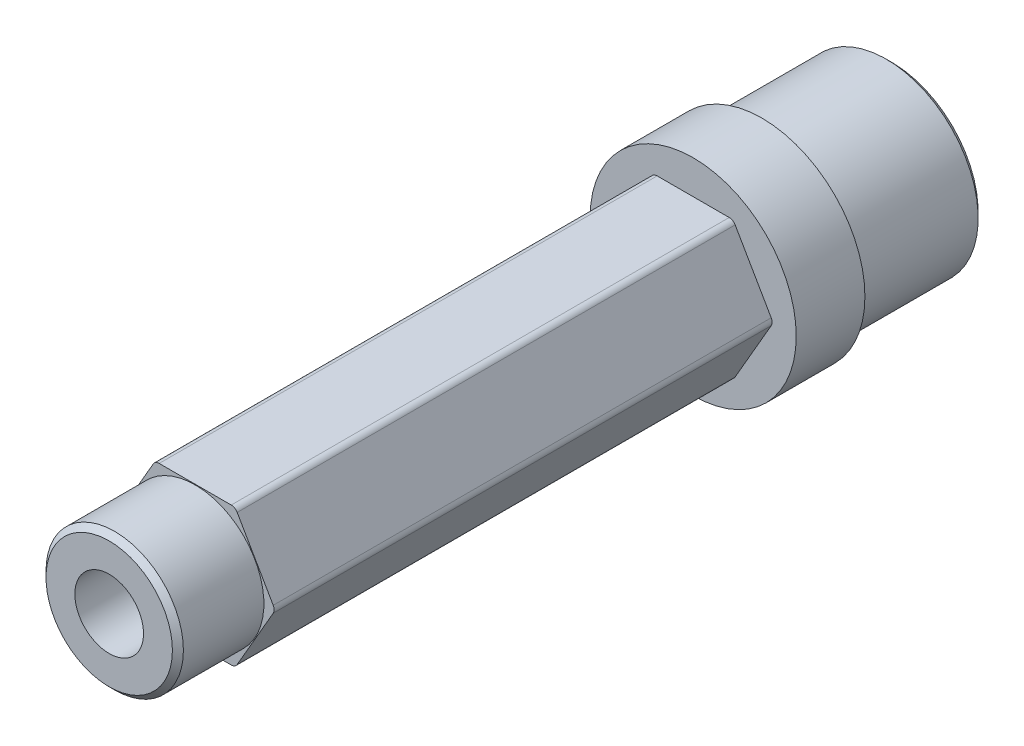
ISO-10303-21;
HEADER;
FILE_DESCRIPTION(('STEP AP214'),'2;1');
FILE_NAME('part.step','',(''),(''),'','','');
FILE_SCHEMA(('AUTOMOTIVE_DESIGN { 1 0 10303 214 1 1 1 1 }'));
ENDSEC;
DATA;
#1=APPLICATION_CONTEXT('core data for automotive mechanical design processes');
#2=APPLICATION_PROTOCOL_DEFINITION('international standard','automotive_design',2000,#1);
#3=PRODUCT_CONTEXT('',#1,'mechanical');
#4=PRODUCT('Part','Part','',(#3));
#5=PRODUCT_RELATED_PRODUCT_CATEGORY('part','',(#4));
#6=PRODUCT_DEFINITION_FORMATION('','',#4);
#7=PRODUCT_DEFINITION_CONTEXT('part definition',#1,'design');
#8=PRODUCT_DEFINITION('design','',#6,#7);
#9=PRODUCT_DEFINITION_SHAPE('','',#8);
#10=(LENGTH_UNIT() NAMED_UNIT(*) SI_UNIT(.MILLI.,.METRE.));
#11=(NAMED_UNIT(*) PLANE_ANGLE_UNIT() SI_UNIT($,.RADIAN.));
#12=(NAMED_UNIT(*) SI_UNIT($,.STERADIAN.) SOLID_ANGLE_UNIT());
#13=UNCERTAINTY_MEASURE_WITH_UNIT(LENGTH_MEASURE(1.E-05),#10,'distance_accuracy_value','');
#14=(GEOMETRIC_REPRESENTATION_CONTEXT(3) GLOBAL_UNCERTAINTY_ASSIGNED_CONTEXT((#13)) GLOBAL_UNIT_ASSIGNED_CONTEXT((#10,
#11,#12)) REPRESENTATION_CONTEXT('',''));
#15=CARTESIAN_POINT('',(0.,0.,0.));
#16=DIRECTION('',(0.,0.,1.));
#17=DIRECTION('',(1.,0.,0.));
#18=AXIS2_PLACEMENT_3D('',#15,#16,#17);
#19=CARTESIAN_POINT('',(0.,8.50000000000001,-72.33270001));
#20=DIRECTION('',(0.,0.,-1.));
#21=DIRECTION('',(-1.,0.,0.));
#22=AXIS2_PLACEMENT_3D('',#19,#20,#21);
#23=PLANE('',#22);
#24=CARTESIAN_POINT('',(0.,0.,-72.33270001));
#25=DIRECTION('',(0.,0.,-1.));
#26=DIRECTION('',(-1.,0.,0.));
#27=AXIS2_PLACEMENT_3D('',#24,#25,#26);
#28=CIRCLE('',#27,7.99200000000001);
#29=CARTESIAN_POINT('',(-7.99200000000001,0.,-72.33270001));
#30=VERTEX_POINT('',#29);
#31=EDGE_CURVE('E250',#30,#30,#28,.T.);
#32=ORIENTED_EDGE('',*,*,#31,.T.);
#33=EDGE_LOOP('',(#32));
#34=FACE_BOUND('',#33,.T.);
#35=ADVANCED_FACE('F38',(#34),#23,.T.);
#36=CARTESIAN_POINT('',(0.,0.,0.));
#37=DIRECTION('',(0.,0.,-1.));
#38=DIRECTION('',(-1.,0.,0.));
#39=AXIS2_PLACEMENT_3D('',#36,#37,#38);
#40=CYLINDRICAL_SURFACE('',#39,8.50000000000001);
#41=CARTESIAN_POINT('',(0.,0.,-71.82470001));
#42=DIRECTION('',(0.,0.,-1.));
#43=DIRECTION('',(-1.,0.,0.));
#44=AXIS2_PLACEMENT_3D('',#41,#42,#43);
#45=CIRCLE('',#44,8.50000000000001);
#46=CARTESIAN_POINT('',(-8.50000000000001,0.,-71.82470001));
#47=VERTEX_POINT('',#46);
#48=EDGE_CURVE('E253',#47,#47,#45,.F.);
#49=ORIENTED_EDGE('',*,*,#48,.T.);
#50=EDGE_LOOP('',(#49));
#51=FACE_BOUND('',#50,.T.);
#52=CARTESIAN_POINT('',(0.,0.,-60.33270001));
#53=DIRECTION('',(0.,0.,-1.));
#54=DIRECTION('',(-1.,0.,0.));
#55=AXIS2_PLACEMENT_3D('',#52,#53,#54);
#56=CIRCLE('',#55,8.50000000000001);
#57=CARTESIAN_POINT('',(-8.50000000000001,0.,-60.33270001));
#58=VERTEX_POINT('',#57);
#59=EDGE_CURVE('E241',#58,#58,#56,.T.);
#60=ORIENTED_EDGE('',*,*,#59,.T.);
#61=EDGE_LOOP('',(#60));
#62=FACE_BOUND('',#61,.T.);
#63=ADVANCED_FACE('F277',(#51,#62),#40,.T.);
#64=CARTESIAN_POINT('',(0.,9.52500000000001,-60.33270001));
#65=DIRECTION('',(0.,0.,-1.));
#66=DIRECTION('',(-1.,0.,0.));
#67=AXIS2_PLACEMENT_3D('',#64,#65,#66);
#68=PLANE('',#67);
#69=CARTESIAN_POINT('',(0.,0.,-60.33270001));
#70=DIRECTION('',(0.,0.,-1.));
#71=DIRECTION('',(-1.,0.,0.));
#72=AXIS2_PLACEMENT_3D('',#69,#70,#71);
#73=CIRCLE('',#72,9.52500000000001);
#74=CARTESIAN_POINT('',(-9.52500000000001,0.,-60.33270001));
#75=VERTEX_POINT('',#74);
#76=EDGE_CURVE('E238',#75,#75,#73,.T.);
#77=ORIENTED_EDGE('',*,*,#76,.T.);
#78=EDGE_LOOP('',(#77));
#79=FACE_BOUND('',#78,.T.);
#80=ORIENTED_EDGE('',*,*,#59,.F.);
#81=EDGE_LOOP('',(#80));
#82=FACE_BOUND('',#81,.T.);
#83=ADVANCED_FACE('F283',(#79,#82),#68,.T.);
#84=CARTESIAN_POINT('',(0.,0.,0.));
#85=DIRECTION('',(0.,0.,-1.));
#86=DIRECTION('',(-1.,0.,0.));
#87=AXIS2_PLACEMENT_3D('',#84,#85,#86);
#88=CYLINDRICAL_SURFACE('',#87,9.52500000000001);
#89=CARTESIAN_POINT('',(0.,0.,-53.98270001));
#90=DIRECTION('',(0.,0.,-1.));
#91=DIRECTION('',(-1.,0.,0.));
#92=AXIS2_PLACEMENT_3D('',#89,#90,#91);
#93=CIRCLE('',#92,9.52500000000001);
#94=CARTESIAN_POINT('',(-9.52500000000001,0.,-53.98270001));
#95=VERTEX_POINT('',#94);
#96=EDGE_CURVE('E235',#95,#95,#93,.T.);
#97=ORIENTED_EDGE('',*,*,#96,.T.);
#98=EDGE_LOOP('',(#97));
#99=FACE_BOUND('',#98,.T.);
#100=ORIENTED_EDGE('',*,*,#76,.F.);
#101=EDGE_LOOP('',(#100));
#102=FACE_BOUND('',#101,.T.);
#103=ADVANCED_FACE('F314',(#99,#102),#88,.T.);
#104=CARTESIAN_POINT('',(0.,7.62,-53.98270001));
#105=DIRECTION('',(0.,0.,1.));
#106=DIRECTION('',(1.,0.,0.));
#107=AXIS2_PLACEMENT_3D('',#104,#105,#106);
#108=PLANE('',#107);
#109=ORIENTED_EDGE('',*,*,#96,.F.);
#110=EDGE_LOOP('',(#109));
#111=FACE_BOUND('',#110,.T.);
#112=DIRECTION('',(0.5,0.866025403784439,0.));
#113=VECTOR('',#112,1.);
#114=CARTESIAN_POINT('',(-3.6969700727127,6.40334,-53.98270001));
#115=LINE('',#114,#113);
#116=CARTESIAN_POINT('',(-7.21063143495769,0.317499999999993,-53.98270001));
#117=VERTEX_POINT('',#116);
#118=CARTESIAN_POINT('',(-3.88027878318041,6.08584,-53.98270001));
#119=VERTEX_POINT('',#118);
#120=EDGE_CURVE('E204',#117,#119,#115,.T.);
#121=ORIENTED_EDGE('',*,*,#120,.T.);
#122=CARTESIAN_POINT('',(-3.33035265177729,5.76834,-53.98270001));
#123=DIRECTION('',(0.,0.,1.));
#124=DIRECTION('',(1.,0.,0.));
#125=AXIS2_PLACEMENT_3D('',#122,#123,#124);
#126=CIRCLE('',#125,0.635);
#127=CARTESIAN_POINT('',(-3.33035265177729,6.40334,-53.98270001));
#128=VERTEX_POINT('',#127);
#129=EDGE_CURVE('E197',#119,#128,#126,.F.);
#130=ORIENTED_EDGE('',*,*,#129,.T.);
#131=DIRECTION('',(1.,0.,0.));
#132=VECTOR('',#131,1.);
#133=CARTESIAN_POINT('',(3.6969700727127,6.40334,-53.98270001));
#134=LINE('',#133,#132);
#135=CARTESIAN_POINT('',(3.33035265177728,6.40334,-53.98270001));
#136=VERTEX_POINT('',#135);
#137=EDGE_CURVE('E202',#128,#136,#134,.T.);
#138=ORIENTED_EDGE('',*,*,#137,.T.);
#139=CARTESIAN_POINT('',(3.33035265177728,5.76834,-53.98270001));
#140=DIRECTION('',(0.,0.,1.));
#141=DIRECTION('',(1.,0.,0.));
#142=AXIS2_PLACEMENT_3D('',#139,#140,#141);
#143=CIRCLE('',#142,0.635);
#144=CARTESIAN_POINT('',(3.8802787831804,6.08584,-53.98270001));
#145=VERTEX_POINT('',#144);
#146=EDGE_CURVE('E46',#136,#145,#143,.F.);
#147=ORIENTED_EDGE('',*,*,#146,.T.);
#148=DIRECTION('',(0.5,-0.866025403784439,0.));
#149=VECTOR('',#148,1.);
#150=CARTESIAN_POINT('',(7.3939401454254,0.,-53.98270001));
#151=LINE('',#150,#149);
#152=CARTESIAN_POINT('',(7.21063143495769,0.317500000000001,-53.98270001));
#153=VERTEX_POINT('',#152);
#154=EDGE_CURVE('E213',#145,#153,#151,.T.);
#155=ORIENTED_EDGE('',*,*,#154,.T.);
#156=CARTESIAN_POINT('',(6.66070530355457,0.,-53.98270001));
#157=DIRECTION('',(0.,0.,1.));
#158=DIRECTION('',(1.,0.,0.));
#159=AXIS2_PLACEMENT_3D('',#156,#157,#158);
#160=CIRCLE('',#159,0.635);
#161=CARTESIAN_POINT('',(7.21063143495769,-0.317499999999999,-53.98270001));
#162=VERTEX_POINT('',#161);
#163=EDGE_CURVE('E13',#153,#162,#160,.F.);
#164=ORIENTED_EDGE('',*,*,#163,.T.);
#165=DIRECTION('',(-0.5,-0.866025403784439,0.));
#166=VECTOR('',#165,1.);
#167=CARTESIAN_POINT('',(3.6969700727127,-6.40334,-53.98270001));
#168=LINE('',#167,#166);
#169=CARTESIAN_POINT('',(3.88027878318041,-6.08584,-53.98270001));
#170=VERTEX_POINT('',#169);
#171=EDGE_CURVE('E460',#162,#170,#168,.T.);
#172=ORIENTED_EDGE('',*,*,#171,.T.);
#173=CARTESIAN_POINT('',(3.33035265177729,-5.76834,-53.98270001));
#174=DIRECTION('',(0.,0.,1.));
#175=DIRECTION('',(1.,0.,0.));
#176=AXIS2_PLACEMENT_3D('',#173,#174,#175);
#177=CIRCLE('',#176,0.635);
#178=CARTESIAN_POINT('',(3.33035265177729,-6.40334,-53.98270001));
#179=VERTEX_POINT('',#178);
#180=EDGE_CURVE('E192',#170,#179,#177,.F.);
#181=ORIENTED_EDGE('',*,*,#180,.T.);
#182=DIRECTION('',(-1.,0.,0.));
#183=VECTOR('',#182,1.);
#184=CARTESIAN_POINT('',(-3.69697007271269,-6.40334,-53.98270001));
#185=LINE('',#184,#183);
#186=CARTESIAN_POINT('',(-3.33035265177728,-6.40334,-53.98270001));
#187=VERTEX_POINT('',#186);
#188=EDGE_CURVE('E464',#179,#187,#185,.T.);
#189=ORIENTED_EDGE('',*,*,#188,.T.);
#190=CARTESIAN_POINT('',(-3.33035265177728,-5.76834,-53.98270001));
#191=DIRECTION('',(0.,0.,1.));
#192=DIRECTION('',(1.,0.,0.));
#193=AXIS2_PLACEMENT_3D('',#190,#191,#192);
#194=CIRCLE('',#193,0.635);
#195=CARTESIAN_POINT('',(-3.8802787831804,-6.08584,-53.98270001));
#196=VERTEX_POINT('',#195);
#197=EDGE_CURVE('E152',#187,#196,#194,.F.);
#198=ORIENTED_EDGE('',*,*,#197,.T.);
#199=DIRECTION('',(-0.5,0.866025403784439,0.));
#200=VECTOR('',#199,1.);
#201=CARTESIAN_POINT('',(-7.39394014542539,0.,-53.98270001));
#202=LINE('',#201,#200);
#203=CARTESIAN_POINT('',(-7.21063143495769,-0.317500000000004,-53.98270001));
#204=VERTEX_POINT('',#203);
#205=EDGE_CURVE('E466',#196,#204,#202,.T.);
#206=ORIENTED_EDGE('',*,*,#205,.T.);
#207=CARTESIAN_POINT('',(-6.66070530355457,0.,-53.98270001));
#208=DIRECTION('',(0.,0.,1.));
#209=DIRECTION('',(1.,0.,0.));
#210=AXIS2_PLACEMENT_3D('',#207,#208,#209);
#211=CIRCLE('',#210,0.635);
#212=EDGE_CURVE('E195',#204,#117,#211,.F.);
#213=ORIENTED_EDGE('',*,*,#212,.T.);
#214=EDGE_LOOP('',(#121,#130,#138,#147,#155,#164,#172,#181,#189,#198,#206,#213));
#215=FACE_BOUND('',#214,.T.);
#216=ADVANCED_FACE('F201',(#111,#215),#108,.T.);
#217=CARTESIAN_POINT('',(3.6969700727127,6.40334,-81.1928760568396));
#218=DIRECTION('',(0.,1.,0.));
#219=DIRECTION('',(-1.,0.,0.));
#220=AXIS2_PLACEMENT_3D('',#217,#218,#219);
#221=PLANE('',#220);
#222=ORIENTED_EDGE('',*,*,#137,.F.);
#223=DIRECTION('',(0.,0.,1.));
#224=VECTOR('',#223,1.);
#225=CARTESIAN_POINT('',(-3.33035265177729,6.40334,-81.1928760568396));
#226=LINE('',#225,#224);
#227=CARTESIAN_POINT('',(-3.33035265177729,6.40334,-7.9502));
#228=VERTEX_POINT('',#227);
#229=EDGE_CURVE('E185',#128,#228,#226,.T.);
#230=ORIENTED_EDGE('',*,*,#229,.T.);
#231=DIRECTION('',(-1.,0.,0.));
#232=VECTOR('',#231,1.);
#233=CARTESIAN_POINT('',(3.6969700727127,6.40334,-7.9502));
#234=LINE('',#233,#232);
#235=CARTESIAN_POINT('',(3.33035265177728,6.40334,-7.9502));
#236=VERTEX_POINT('',#235);
#237=EDGE_CURVE('E219',#236,#228,#234,.T.);
#238=ORIENTED_EDGE('',*,*,#237,.F.);
#239=DIRECTION('',(0.,0.,1.));
#240=VECTOR('',#239,1.);
#241=CARTESIAN_POINT('',(3.33035265177728,6.40334,-81.1928760568396));
#242=LINE('',#241,#240);
#243=EDGE_CURVE('E183',#236,#136,#242,.F.);
#244=ORIENTED_EDGE('',*,*,#243,.T.);
#245=EDGE_LOOP('',(#222,#230,#238,#244));
#246=FACE_BOUND('',#245,.T.);
#247=ADVANCED_FACE('F209',(#246),#221,.T.);
#248=CARTESIAN_POINT('',(-3.6969700727127,6.40334,-81.1928760568396));
#249=DIRECTION('',(-0.866025403784439,0.499999999999999,0.));
#250=DIRECTION('',(-0.5,-0.866025403784439,0.));
#251=AXIS2_PLACEMENT_3D('',#248,#249,#250);
#252=PLANE('',#251);
#253=ORIENTED_EDGE('',*,*,#120,.F.);
#254=DIRECTION('',(0.,0.,1.));
#255=VECTOR('',#254,1.);
#256=CARTESIAN_POINT('',(-7.21063143495769,0.317499999999996,-81.1928760568396));
#257=LINE('',#256,#255);
#258=CARTESIAN_POINT('',(-7.21063143495769,0.317499999999996,-7.9502));
#259=VERTEX_POINT('',#258);
#260=EDGE_CURVE('E180',#117,#259,#257,.T.);
#261=ORIENTED_EDGE('',*,*,#260,.T.);
#262=DIRECTION('',(-0.499999999999999,-0.866025403784439,0.));
#263=VECTOR('',#262,1.);
#264=CARTESIAN_POINT('',(-3.6969700727127,6.40334,-7.9502));
#265=LINE('',#264,#263);
#266=CARTESIAN_POINT('',(-3.88027878318041,6.08584,-7.9502));
#267=VERTEX_POINT('',#266);
#268=EDGE_CURVE('E218',#267,#259,#265,.T.);
#269=ORIENTED_EDGE('',*,*,#268,.F.);
#270=DIRECTION('',(0.,0.,1.));
#271=VECTOR('',#270,1.);
#272=CARTESIAN_POINT('',(-3.88027878318041,6.08584,-81.1928760568396));
#273=LINE('',#272,#271);
#274=EDGE_CURVE('E178',#267,#119,#273,.F.);
#275=ORIENTED_EDGE('',*,*,#274,.T.);
#276=EDGE_LOOP('',(#253,#261,#269,#275));
#277=FACE_BOUND('',#276,.T.);
#278=ADVANCED_FACE('F221',(#277),#252,.T.);
#279=CARTESIAN_POINT('',(-7.39394014542539,0.,-81.1928760568396));
#280=DIRECTION('',(-0.866025403784438,-0.5,0.));
#281=DIRECTION('',(0.5,-0.866025403784439,0.));
#282=AXIS2_PLACEMENT_3D('',#279,#280,#281);
#283=PLANE('',#282);
#284=ORIENTED_EDGE('',*,*,#205,.F.);
#285=DIRECTION('',(0.,0.,1.));
#286=VECTOR('',#285,1.);
#287=CARTESIAN_POINT('',(-3.8802787831804,-6.08584,-81.1928760568396));
#288=LINE('',#287,#286);
#289=CARTESIAN_POINT('',(-3.8802787831804,-6.08584,-7.9502));
#290=VERTEX_POINT('',#289);
#291=EDGE_CURVE('E176',#196,#290,#288,.T.);
#292=ORIENTED_EDGE('',*,*,#291,.T.);
#293=DIRECTION('',(0.5,-0.866025403784438,0.));
#294=VECTOR('',#293,1.);
#295=CARTESIAN_POINT('',(-7.39394014542539,0.,-7.9502));
#296=LINE('',#295,#294);
#297=CARTESIAN_POINT('',(-7.21063143495769,-0.317500000000004,-7.9502));
#298=VERTEX_POINT('',#297);
#299=EDGE_CURVE('E132',#298,#290,#296,.T.);
#300=ORIENTED_EDGE('',*,*,#299,.F.);
#301=DIRECTION('',(0.,0.,1.));
#302=VECTOR('',#301,1.);
#303=CARTESIAN_POINT('',(-7.21063143495769,-0.317500000000004,-81.1928760568396));
#304=LINE('',#303,#302);
#305=EDGE_CURVE('E174',#298,#204,#304,.F.);
#306=ORIENTED_EDGE('',*,*,#305,.T.);
#307=EDGE_LOOP('',(#284,#292,#300,#306));
#308=FACE_BOUND('',#307,.T.);
#309=ADVANCED_FACE('F349',(#308),#283,.T.);
#310=CARTESIAN_POINT('',(-3.69697007271269,-6.40334,-81.1928760568396));
#311=DIRECTION('',(0.,-1.,0.));
#312=DIRECTION('',(1.,0.,0.));
#313=AXIS2_PLACEMENT_3D('',#310,#311,#312);
#314=PLANE('',#313);
#315=ORIENTED_EDGE('',*,*,#188,.F.);
#316=DIRECTION('',(0.,0.,1.));
#317=VECTOR('',#316,1.);
#318=CARTESIAN_POINT('',(3.33035265177729,-6.40334,-81.1928760568396));
#319=LINE('',#318,#317);
#320=CARTESIAN_POINT('',(3.33035265177729,-6.40334,-7.9502));
#321=VERTEX_POINT('',#320);
#322=EDGE_CURVE('E147',#179,#321,#319,.T.);
#323=ORIENTED_EDGE('',*,*,#322,.T.);
#324=DIRECTION('',(1.,0.,0.));
#325=VECTOR('',#324,1.);
#326=CARTESIAN_POINT('',(-3.69697007271269,-6.40334,-7.9502));
#327=LINE('',#326,#325);
#328=CARTESIAN_POINT('',(-3.33035265177728,-6.40334,-7.9502));
#329=VERTEX_POINT('',#328);
#330=EDGE_CURVE('E130',#329,#321,#327,.T.);
#331=ORIENTED_EDGE('',*,*,#330,.F.);
#332=DIRECTION('',(0.,0.,1.));
#333=VECTOR('',#332,1.);
#334=CARTESIAN_POINT('',(-3.33035265177728,-6.40334,-81.1928760568396));
#335=LINE('',#334,#333);
#336=EDGE_CURVE('E144',#329,#187,#335,.F.);
#337=ORIENTED_EDGE('',*,*,#336,.T.);
#338=EDGE_LOOP('',(#315,#323,#331,#337));
#339=FACE_BOUND('',#338,.T.);
#340=ADVANCED_FACE('F143',(#339),#314,.T.);
#341=CARTESIAN_POINT('',(3.6969700727127,-6.40334,-81.1928760568396));
#342=DIRECTION('',(0.866025403784439,-0.5,0.));
#343=DIRECTION('',(0.5,0.866025403784439,0.));
#344=AXIS2_PLACEMENT_3D('',#341,#342,#343);
#345=PLANE('',#344);
#346=DIRECTION('',(0.5,0.866025403784439,0.));
#347=VECTOR('',#346,1.);
#348=CARTESIAN_POINT('',(3.6969700727127,-6.40334,-7.9502));
#349=LINE('',#348,#347);
#350=CARTESIAN_POINT('',(3.88027878318041,-6.08584,-7.9502));
#351=VERTEX_POINT('',#350);
#352=CARTESIAN_POINT('',(7.21063143495769,-0.317499999999999,-7.9502));
#353=VERTEX_POINT('',#352);
#354=EDGE_CURVE('E148',#351,#353,#349,.T.);
#355=ORIENTED_EDGE('',*,*,#354,.F.);
#356=DIRECTION('',(0.,0.,1.));
#357=VECTOR('',#356,1.);
#358=CARTESIAN_POINT('',(3.88027878318041,-6.08584,-81.1928760568396));
#359=LINE('',#358,#357);
#360=EDGE_CURVE('E172',#351,#170,#359,.F.);
#361=ORIENTED_EDGE('',*,*,#360,.T.);
#362=ORIENTED_EDGE('',*,*,#171,.F.);
#363=DIRECTION('',(0.,0.,1.));
#364=VECTOR('',#363,1.);
#365=CARTESIAN_POINT('',(7.21063143495769,-0.317499999999998,-81.1928760568396));
#366=LINE('',#365,#364);
#367=EDGE_CURVE('E169',#162,#353,#366,.T.);
#368=ORIENTED_EDGE('',*,*,#367,.T.);
#369=EDGE_LOOP('',(#355,#361,#362,#368));
#370=FACE_BOUND('',#369,.T.);
#371=ADVANCED_FACE('F363',(#370),#345,.T.);
#372=CARTESIAN_POINT('',(7.3939401454254,0.,-81.1928760568396));
#373=DIRECTION('',(0.866025403784439,0.5,0.));
#374=DIRECTION('',(-0.5,0.866025403784439,0.));
#375=AXIS2_PLACEMENT_3D('',#372,#373,#374);
#376=PLANE('',#375);
#377=ORIENTED_EDGE('',*,*,#154,.F.);
#378=DIRECTION('',(0.,0.,1.));
#379=VECTOR('',#378,1.);
#380=CARTESIAN_POINT('',(3.8802787831804,6.08584,-81.1928760568396));
#381=LINE('',#380,#379);
#382=CARTESIAN_POINT('',(3.8802787831804,6.08584,-7.9502));
#383=VERTEX_POINT('',#382);
#384=EDGE_CURVE('E189',#145,#383,#381,.T.);
#385=ORIENTED_EDGE('',*,*,#384,.T.);
#386=DIRECTION('',(-0.5,0.866025403784439,0.));
#387=VECTOR('',#386,1.);
#388=CARTESIAN_POINT('',(7.3939401454254,0.,-7.9502));
#389=LINE('',#388,#387);
#390=CARTESIAN_POINT('',(7.21063143495769,0.317500000000001,-7.9502));
#391=VERTEX_POINT('',#390);
#392=EDGE_CURVE('E225',#391,#383,#389,.T.);
#393=ORIENTED_EDGE('',*,*,#392,.F.);
#394=DIRECTION('',(0.,0.,1.));
#395=VECTOR('',#394,1.);
#396=CARTESIAN_POINT('',(7.21063143495769,0.317500000000001,-81.1928760568396));
#397=LINE('',#396,#395);
#398=EDGE_CURVE('E53',#391,#153,#397,.F.);
#399=ORIENTED_EDGE('',*,*,#398,.T.);
#400=EDGE_LOOP('',(#377,#385,#393,#399));
#401=FACE_BOUND('',#400,.T.);
#402=ADVANCED_FACE('F292',(#401),#376,.T.);
#403=CARTESIAN_POINT('',(0.,3.175,-6.858));
#404=DIRECTION('',(0.,0.,1.));
#405=DIRECTION('',(1.,0.,0.));
#406=AXIS2_PLACEMENT_3D('',#403,#404,#405);
#407=PLANE('',#406);
#408=CARTESIAN_POINT('',(0.,0.,-6.858));
#409=DIRECTION('',(0.,0.,-1.));
#410=DIRECTION('',(-1.,0.,0.));
#411=AXIS2_PLACEMENT_3D('',#408,#409,#410);
#412=CIRCLE('',#411,3.175);
#413=CARTESIAN_POINT('',(-3.175,0.,-6.858));
#414=VERTEX_POINT('',#413);
#415=EDGE_CURVE('E244',#414,#414,#412,.T.);
#416=ORIENTED_EDGE('',*,*,#415,.F.);
#417=EDGE_LOOP('',(#416));
#418=FACE_BOUND('',#417,.T.);
#419=ADVANCED_FACE('F288',(#418),#407,.T.);
#420=CARTESIAN_POINT('',(0.,0.,0.));
#421=DIRECTION('',(0.,0.,-1.));
#422=DIRECTION('',(-1.,0.,0.));
#423=AXIS2_PLACEMENT_3D('',#420,#421,#422);
#424=CYLINDRICAL_SURFACE('',#423,3.175);
#425=ORIENTED_EDGE('',*,*,#415,.T.);
#426=EDGE_LOOP('',(#425));
#427=FACE_BOUND('',#426,.T.);
#428=CARTESIAN_POINT('',(0.,0.,0.));
#429=DIRECTION('',(0.,0.,-1.));
#430=DIRECTION('',(-1.,0.,0.));
#431=AXIS2_PLACEMENT_3D('',#428,#429,#430);
#432=CIRCLE('',#431,3.175);
#433=CARTESIAN_POINT('',(-3.175,0.,0.));
#434=VERTEX_POINT('',#433);
#435=EDGE_CURVE('E247',#434,#434,#432,.T.);
#436=ORIENTED_EDGE('',*,*,#435,.F.);
#437=EDGE_LOOP('',(#436));
#438=FACE_BOUND('',#437,.T.);
#439=ADVANCED_FACE('F291',(#427,#438),#424,.F.);
#440=CARTESIAN_POINT('',(0.,3.175,0.));
#441=DIRECTION('',(0.,0.,1.));
#442=DIRECTION('',(1.,0.,0.));
#443=AXIS2_PLACEMENT_3D('',#440,#441,#442);
#444=PLANE('',#443);
#445=CARTESIAN_POINT('',(0.,0.,0.));
#446=DIRECTION('',(0.,0.,1.));
#447=DIRECTION('',(1.,0.,0.));
#448=AXIS2_PLACEMENT_3D('',#445,#446,#447);
#449=CIRCLE('',#448,5.84200000000001);
#450=CARTESIAN_POINT('',(5.84200000000001,0.,0.));
#451=VERTEX_POINT('',#450);
#452=EDGE_CURVE('E153',#451,#451,#449,.T.);
#453=ORIENTED_EDGE('',*,*,#452,.T.);
#454=EDGE_LOOP('',(#453));
#455=FACE_BOUND('',#454,.T.);
#456=ORIENTED_EDGE('',*,*,#435,.T.);
#457=EDGE_LOOP('',(#456));
#458=FACE_BOUND('',#457,.T.);
#459=ADVANCED_FACE('F296',(#455,#458),#444,.T.);
#460=CARTESIAN_POINT('',(0.,0.,0.));
#461=DIRECTION('',(0.,0.,-1.));
#462=DIRECTION('',(-1.,0.,0.));
#463=AXIS2_PLACEMENT_3D('',#460,#461,#462);
#464=CYLINDRICAL_SURFACE('',#463,6.35);
#465=CARTESIAN_POINT('',(0.,0.,-0.507999999999991));
#466=DIRECTION('',(0.,0.,1.));
#467=DIRECTION('',(1.,0.,0.));
#468=AXIS2_PLACEMENT_3D('',#465,#466,#467);
#469=CIRCLE('',#468,6.35);
#470=CARTESIAN_POINT('',(6.35,0.,-0.507999999999991));
#471=VERTEX_POINT('',#470);
#472=EDGE_CURVE('E158',#471,#471,#469,.F.);
#473=ORIENTED_EDGE('',*,*,#472,.T.);
#474=EDGE_LOOP('',(#473));
#475=FACE_BOUND('',#474,.T.);
#476=CARTESIAN_POINT('',(0.,0.,-7.9502));
#477=DIRECTION('',(0.,0.,-1.));
#478=DIRECTION('',(-1.,0.,0.));
#479=AXIS2_PLACEMENT_3D('',#476,#477,#478);
#480=CIRCLE('',#479,6.35);
#481=CARTESIAN_POINT('',(-6.35,0.,-7.9502));
#482=VERTEX_POINT('',#481);
#483=EDGE_CURVE('E231',#482,#482,#480,.T.);
#484=ORIENTED_EDGE('',*,*,#483,.F.);
#485=EDGE_LOOP('',(#484));
#486=FACE_BOUND('',#485,.T.);
#487=ADVANCED_FACE('F258',(#475,#486),#464,.T.);
#488=CARTESIAN_POINT('',(0.,6.35,-7.9502));
#489=DIRECTION('',(0.,0.,1.));
#490=DIRECTION('',(1.,0.,0.));
#491=AXIS2_PLACEMENT_3D('',#488,#489,#490);
#492=PLANE('',#491);
#493=ORIENTED_EDGE('',*,*,#483,.T.);
#494=EDGE_LOOP('',(#493));
#495=FACE_BOUND('',#494,.T.);
#496=ORIENTED_EDGE('',*,*,#330,.T.);
#497=CARTESIAN_POINT('',(3.33035265177729,-5.76834,-7.9502));
#498=DIRECTION('',(0.,0.,1.));
#499=DIRECTION('',(1.,0.,0.));
#500=AXIS2_PLACEMENT_3D('',#497,#498,#499);
#501=CIRCLE('',#500,0.635);
#502=EDGE_CURVE('E137',#321,#351,#501,.T.);
#503=ORIENTED_EDGE('',*,*,#502,.T.);
#504=ORIENTED_EDGE('',*,*,#354,.T.);
#505=CARTESIAN_POINT('',(6.66070530355457,0.,-7.9502));
#506=DIRECTION('',(0.,0.,1.));
#507=DIRECTION('',(1.,0.,0.));
#508=AXIS2_PLACEMENT_3D('',#505,#506,#507);
#509=CIRCLE('',#508,0.635);
#510=EDGE_CURVE('E155',#353,#391,#509,.T.);
#511=ORIENTED_EDGE('',*,*,#510,.T.);
#512=ORIENTED_EDGE('',*,*,#392,.T.);
#513=CARTESIAN_POINT('',(3.33035265177728,5.76834,-7.9502));
#514=DIRECTION('',(0.,0.,1.));
#515=DIRECTION('',(1.,0.,0.));
#516=AXIS2_PLACEMENT_3D('',#513,#514,#515);
#517=CIRCLE('',#516,0.635);
#518=EDGE_CURVE('E163',#383,#236,#517,.T.);
#519=ORIENTED_EDGE('',*,*,#518,.T.);
#520=ORIENTED_EDGE('',*,*,#237,.T.);
#521=CARTESIAN_POINT('',(-3.33035265177729,5.76834,-7.9502));
#522=DIRECTION('',(0.,0.,1.));
#523=DIRECTION('',(1.,0.,0.));
#524=AXIS2_PLACEMENT_3D('',#521,#522,#523);
#525=CIRCLE('',#524,0.635);
#526=EDGE_CURVE('E165',#228,#267,#525,.T.);
#527=ORIENTED_EDGE('',*,*,#526,.T.);
#528=ORIENTED_EDGE('',*,*,#268,.T.);
#529=CARTESIAN_POINT('',(-6.66070530355457,0.,-7.9502));
#530=DIRECTION('',(0.,0.,1.));
#531=DIRECTION('',(1.,0.,0.));
#532=AXIS2_PLACEMENT_3D('',#529,#530,#531);
#533=CIRCLE('',#532,0.635);
#534=EDGE_CURVE('E138',#259,#298,#533,.T.);
#535=ORIENTED_EDGE('',*,*,#534,.T.);
#536=ORIENTED_EDGE('',*,*,#299,.T.);
#537=CARTESIAN_POINT('',(-3.33035265177728,-5.76834,-7.9502));
#538=DIRECTION('',(0.,0.,1.));
#539=DIRECTION('',(1.,0.,0.));
#540=AXIS2_PLACEMENT_3D('',#537,#538,#539);
#541=CIRCLE('',#540,0.635);
#542=EDGE_CURVE('E127',#290,#329,#541,.T.);
#543=ORIENTED_EDGE('',*,*,#542,.T.);
#544=EDGE_LOOP('',(#496,#503,#504,#511,#512,#519,#520,#527,#528,#535,#536,#543));
#545=FACE_BOUND('',#544,.T.);
#546=ADVANCED_FACE('F129',(#495,#545),#492,.T.);
#547=CARTESIAN_POINT('',(0.,0.,-72.33270001));
#548=DIRECTION('',(0.,0.,1.));
#549=DIRECTION('',(1.,0.,0.));
#550=AXIS2_PLACEMENT_3D('',#547,#548,#549);
#551=CONICAL_SURFACE('',#550,7.99200000000001,0.785398163397462);
#552=ORIENTED_EDGE('',*,*,#48,.F.);
#553=EDGE_LOOP('',(#552));
#554=FACE_BOUND('',#553,.T.);
#555=ORIENTED_EDGE('',*,*,#31,.F.);
#556=EDGE_LOOP('',(#555));
#557=FACE_BOUND('',#556,.T.);
#558=ADVANCED_FACE('F264',(#554,#557),#551,.T.);
#559=CARTESIAN_POINT('',(0.,0.,-0.507999999999991));
#560=DIRECTION('',(0.,0.,-1.));
#561=DIRECTION('',(-1.,0.,0.));
#562=AXIS2_PLACEMENT_3D('',#559,#560,#561);
#563=CONICAL_SURFACE('',#562,6.35,0.785398163397449);
#564=ORIENTED_EDGE('',*,*,#452,.F.);
#565=EDGE_LOOP('',(#564));
#566=FACE_BOUND('',#565,.T.);
#567=ORIENTED_EDGE('',*,*,#472,.F.);
#568=EDGE_LOOP('',(#567));
#569=FACE_BOUND('',#568,.T.);
#570=ADVANCED_FACE('F261',(#566,#569),#563,.T.);
#571=CARTESIAN_POINT('',(3.33035265177729,-5.76834,-81.1928760568396));
#572=DIRECTION('',(0.,0.,1.));
#573=DIRECTION('',(1.,0.,0.));
#574=AXIS2_PLACEMENT_3D('',#571,#572,#573);
#575=CYLINDRICAL_SURFACE('',#574,0.635);
#576=ORIENTED_EDGE('',*,*,#180,.F.);
#577=ORIENTED_EDGE('',*,*,#360,.F.);
#578=ORIENTED_EDGE('',*,*,#502,.F.);
#579=ORIENTED_EDGE('',*,*,#322,.F.);
#580=EDGE_LOOP('',(#576,#577,#578,#579));
#581=FACE_BOUND('',#580,.T.);
#582=ADVANCED_FACE('F263',(#581),#575,.T.);
#583=CARTESIAN_POINT('',(-3.33035265177728,-5.76834,-81.1928760568396));
#584=DIRECTION('',(0.,0.,1.));
#585=DIRECTION('',(1.,0.,0.));
#586=AXIS2_PLACEMENT_3D('',#583,#584,#585);
#587=CYLINDRICAL_SURFACE('',#586,0.635);
#588=ORIENTED_EDGE('',*,*,#197,.F.);
#589=ORIENTED_EDGE('',*,*,#336,.F.);
#590=ORIENTED_EDGE('',*,*,#542,.F.);
#591=ORIENTED_EDGE('',*,*,#291,.F.);
#592=EDGE_LOOP('',(#588,#589,#590,#591));
#593=FACE_BOUND('',#592,.T.);
#594=ADVANCED_FACE('F151',(#593),#587,.T.);
#595=CARTESIAN_POINT('',(-6.66070530355457,0.,-81.1928760568396));
#596=DIRECTION('',(0.,0.,1.));
#597=DIRECTION('',(1.,0.,0.));
#598=AXIS2_PLACEMENT_3D('',#595,#596,#597);
#599=CYLINDRICAL_SURFACE('',#598,0.635);
#600=ORIENTED_EDGE('',*,*,#212,.F.);
#601=ORIENTED_EDGE('',*,*,#305,.F.);
#602=ORIENTED_EDGE('',*,*,#534,.F.);
#603=ORIENTED_EDGE('',*,*,#260,.F.);
#604=EDGE_LOOP('',(#600,#601,#602,#603));
#605=FACE_BOUND('',#604,.T.);
#606=ADVANCED_FACE('F418',(#605),#599,.T.);
#607=CARTESIAN_POINT('',(-3.33035265177729,5.76834,-81.1928760568396));
#608=DIRECTION('',(0.,0.,1.));
#609=DIRECTION('',(1.,0.,0.));
#610=AXIS2_PLACEMENT_3D('',#607,#608,#609);
#611=CYLINDRICAL_SURFACE('',#610,0.635);
#612=ORIENTED_EDGE('',*,*,#129,.F.);
#613=ORIENTED_EDGE('',*,*,#274,.F.);
#614=ORIENTED_EDGE('',*,*,#526,.F.);
#615=ORIENTED_EDGE('',*,*,#229,.F.);
#616=EDGE_LOOP('',(#612,#613,#614,#615));
#617=FACE_BOUND('',#616,.T.);
#618=ADVANCED_FACE('F215',(#617),#611,.T.);
#619=CARTESIAN_POINT('',(3.33035265177728,5.76834,-81.1928760568396));
#620=DIRECTION('',(0.,0.,1.));
#621=DIRECTION('',(1.,0.,0.));
#622=AXIS2_PLACEMENT_3D('',#619,#620,#621);
#623=CYLINDRICAL_SURFACE('',#622,0.635);
#624=ORIENTED_EDGE('',*,*,#146,.F.);
#625=ORIENTED_EDGE('',*,*,#243,.F.);
#626=ORIENTED_EDGE('',*,*,#518,.F.);
#627=ORIENTED_EDGE('',*,*,#384,.F.);
#628=EDGE_LOOP('',(#624,#625,#626,#627));
#629=FACE_BOUND('',#628,.T.);
#630=ADVANCED_FACE('F434',(#629),#623,.T.);
#631=CARTESIAN_POINT('',(6.66070530355457,0.,-81.1928760568396));
#632=DIRECTION('',(0.,0.,1.));
#633=DIRECTION('',(1.,0.,0.));
#634=AXIS2_PLACEMENT_3D('',#631,#632,#633);
#635=CYLINDRICAL_SURFACE('',#634,0.635);
#636=ORIENTED_EDGE('',*,*,#163,.F.);
#637=ORIENTED_EDGE('',*,*,#398,.F.);
#638=ORIENTED_EDGE('',*,*,#510,.F.);
#639=ORIENTED_EDGE('',*,*,#367,.F.);
#640=EDGE_LOOP('',(#636,#637,#638,#639));
#641=FACE_BOUND('',#640,.T.);
#642=ADVANCED_FACE('F40',(#641),#635,.T.);
#643=CLOSED_SHELL('',(#35,#63,#83,#103,#216,#247,#278,#309,#340,#371,#402,#419,#439,#459,#487,
#546,#558,#570,#582,#594,#606,#618,#630,#642));
#644=MANIFOLD_SOLID_BREP('B2',#643);
#645=ADVANCED_BREP_SHAPE_REPRESENTATION('',(#18,#644),#14);
#646=SHAPE_DEFINITION_REPRESENTATION(#9,#645);
ENDSEC;
END-ISO-10303-21;
